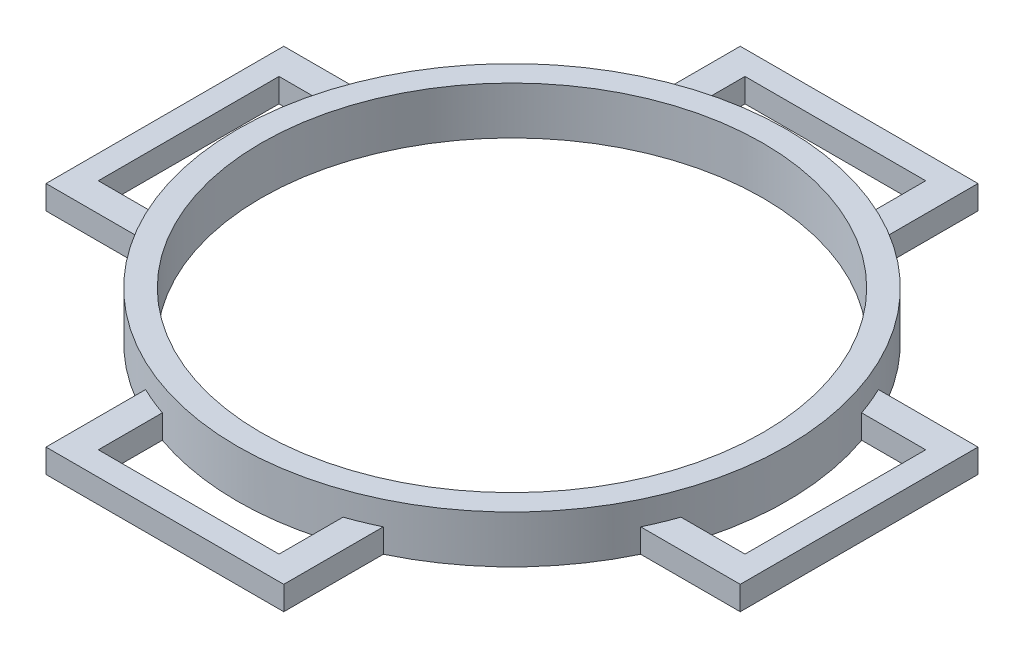
ISO-10303-21;
HEADER;
FILE_DESCRIPTION(('STEP AP214'),'2;1');
FILE_NAME('part.step','',(''),(''),'','','');
FILE_SCHEMA(('AUTOMOTIVE_DESIGN { 1 0 10303 214 1 1 1 1 }'));
ENDSEC;
DATA;
#1=APPLICATION_CONTEXT('core data for automotive mechanical design processes');
#2=APPLICATION_PROTOCOL_DEFINITION('international standard','automotive_design',2000,#1);
#3=PRODUCT_CONTEXT('',#1,'mechanical');
#4=PRODUCT('Part','Part','',(#3));
#5=PRODUCT_RELATED_PRODUCT_CATEGORY('part','',(#4));
#6=PRODUCT_DEFINITION_FORMATION('','',#4);
#7=PRODUCT_DEFINITION_CONTEXT('part definition',#1,'design');
#8=PRODUCT_DEFINITION('design','',#6,#7);
#9=PRODUCT_DEFINITION_SHAPE('','',#8);
#10=(LENGTH_UNIT() NAMED_UNIT(*) SI_UNIT(.MILLI.,.METRE.));
#11=(NAMED_UNIT(*) PLANE_ANGLE_UNIT() SI_UNIT($,.RADIAN.));
#12=(NAMED_UNIT(*) SI_UNIT($,.STERADIAN.) SOLID_ANGLE_UNIT());
#13=UNCERTAINTY_MEASURE_WITH_UNIT(LENGTH_MEASURE(1.E-05),#10,'distance_accuracy_value','');
#14=(GEOMETRIC_REPRESENTATION_CONTEXT(3) GLOBAL_UNCERTAINTY_ASSIGNED_CONTEXT((#13)) GLOBAL_UNIT_ASSIGNED_CONTEXT((#10,
#11,#12)) REPRESENTATION_CONTEXT('',''));
#15=CARTESIAN_POINT('',(0.,0.,0.));
#16=DIRECTION('',(0.,0.,1.));
#17=DIRECTION('',(1.,0.,0.));
#18=AXIS2_PLACEMENT_3D('',#15,#16,#17);
#19=CARTESIAN_POINT('',(0.,18.4724614035785,0.));
#20=DIRECTION('',(0.,1.,0.));
#21=DIRECTION('',(0.,0.,1.));
#22=AXIS2_PLACEMENT_3D('',#19,#20,#21);
#23=CYLINDRICAL_SURFACE('',#22,11.55);
#24=CARTESIAN_POINT('',(0.,1.,0.));
#25=DIRECTION('',(0.,1.,0.));
#26=DIRECTION('',(0.,0.,1.));
#27=AXIS2_PLACEMENT_3D('',#24,#25,#26);
#28=CIRCLE('',#27,11.55);
#29=CARTESIAN_POINT('',(0.,1.,11.55));
#30=VERTEX_POINT('',#29);
#31=EDGE_CURVE('E460',#30,#30,#28,.T.);
#32=ORIENTED_EDGE('',*,*,#31,.F.);
#33=EDGE_LOOP('',(#32));
#34=FACE_BOUND('',#33,.T.);
#35=DIRECTION('',(0.,-1.,0.));
#36=VECTOR('',#35,1.);
#37=CARTESIAN_POINT('',(10.4116521263438,0.,5.00000000000011));
#38=LINE('',#37,#36);
#39=CARTESIAN_POINT('',(10.4116521263438,0.,5.00000000000011));
#40=VERTEX_POINT('',#39);
#41=CARTESIAN_POINT('',(10.4116521263438,-1.,5.00000000000011));
#42=VERTEX_POINT('',#41);
#43=EDGE_CURVE('E55',#40,#42,#38,.T.);
#44=ORIENTED_EDGE('',*,*,#43,.F.);
#45=CARTESIAN_POINT('',(0.,0.,0.));
#46=DIRECTION('',(0.,1.,0.));
#47=DIRECTION('',(0.,0.,1.));
#48=AXIS2_PLACEMENT_3D('',#45,#46,#47);
#49=CIRCLE('',#48,11.55);
#50=CARTESIAN_POINT('',(10.906993169522,0.,3.80000000000011));
#51=VERTEX_POINT('',#50);
#52=EDGE_CURVE('E11',#40,#51,#49,.T.);
#53=ORIENTED_EDGE('',*,*,#52,.T.);
#54=DIRECTION('',(0.,1.,0.));
#55=VECTOR('',#54,1.);
#56=CARTESIAN_POINT('',(10.906993169522,18.4724614035785,3.80000000000011));
#57=LINE('',#56,#55);
#58=CARTESIAN_POINT('',(10.906993169522,-1.,3.80000000000011));
#59=VERTEX_POINT('',#58);
#60=EDGE_CURVE('E299',#59,#51,#57,.T.);
#61=ORIENTED_EDGE('',*,*,#60,.F.);
#62=CARTESIAN_POINT('',(0.,-1.,0.));
#63=DIRECTION('',(0.,1.,0.));
#64=DIRECTION('',(0.,0.,1.));
#65=AXIS2_PLACEMENT_3D('',#62,#63,#64);
#66=CIRCLE('',#65,11.55);
#67=CARTESIAN_POINT('',(10.9069931695221,-1.,-3.79999999999989));
#68=VERTEX_POINT('',#67);
#69=EDGE_CURVE('E508',#59,#68,#66,.T.);
#70=ORIENTED_EDGE('',*,*,#69,.T.);
#71=DIRECTION('',(0.,1.,0.));
#72=VECTOR('',#71,1.);
#73=CARTESIAN_POINT('',(10.9069931695221,18.4724614035785,-3.79999999999989));
#74=LINE('',#73,#72);
#75=CARTESIAN_POINT('',(10.9069931695221,0.,-3.79999999999989));
#76=VERTEX_POINT('',#75);
#77=EDGE_CURVE('E301',#76,#68,#74,.F.);
#78=ORIENTED_EDGE('',*,*,#77,.F.);
#79=CARTESIAN_POINT('',(10.4116521263439,0.,-4.99999999999989));
#80=VERTEX_POINT('',#79);
#81=EDGE_CURVE('E41',#76,#80,#49,.T.);
#82=ORIENTED_EDGE('',*,*,#81,.T.);
#83=DIRECTION('',(0.,-1.,0.));
#84=VECTOR('',#83,1.);
#85=CARTESIAN_POINT('',(10.4116521263439,0.,-4.99999999999989));
#86=LINE('',#85,#84);
#87=CARTESIAN_POINT('',(10.4116521263439,-1.,-4.99999999999989));
#88=VERTEX_POINT('',#87);
#89=EDGE_CURVE('E294',#80,#88,#86,.T.);
#90=ORIENTED_EDGE('',*,*,#89,.T.);
#91=CARTESIAN_POINT('',(5.,-1.,-10.4116521263438));
#92=VERTEX_POINT('',#91);
#93=EDGE_CURVE('E466',#88,#92,#66,.T.);
#94=ORIENTED_EDGE('',*,*,#93,.T.);
#95=DIRECTION('',(0.,-1.,0.));
#96=VECTOR('',#95,1.);
#97=CARTESIAN_POINT('',(5.,0.,-10.4116521263438));
#98=LINE('',#97,#96);
#99=CARTESIAN_POINT('',(5.,0.,-10.4116521263438));
#100=VERTEX_POINT('',#99);
#101=EDGE_CURVE('E348',#100,#92,#98,.T.);
#102=ORIENTED_EDGE('',*,*,#101,.F.);
#103=CARTESIAN_POINT('',(0.,0.,0.));
#104=DIRECTION('',(0.,1.,0.));
#105=DIRECTION('',(0.,0.,1.));
#106=AXIS2_PLACEMENT_3D('',#103,#104,#105);
#107=CIRCLE('',#106,11.55);
#108=CARTESIAN_POINT('',(3.8,0.,-10.906993169522));
#109=VERTEX_POINT('',#108);
#110=EDGE_CURVE('E483',#100,#109,#107,.T.);
#111=ORIENTED_EDGE('',*,*,#110,.T.);
#112=DIRECTION('',(0.,1.,0.));
#113=VECTOR('',#112,1.);
#114=CARTESIAN_POINT('',(3.8,18.4724614035785,-10.906993169522));
#115=LINE('',#114,#113);
#116=CARTESIAN_POINT('',(3.8,-1.,-10.906993169522));
#117=VERTEX_POINT('',#116);
#118=EDGE_CURVE('E351',#117,#109,#115,.T.);
#119=ORIENTED_EDGE('',*,*,#118,.F.);
#120=CARTESIAN_POINT('',(-3.8,-1.,-10.906993169522));
#121=VERTEX_POINT('',#120);
#122=EDGE_CURVE('E507',#117,#121,#66,.T.);
#123=ORIENTED_EDGE('',*,*,#122,.T.);
#124=DIRECTION('',(0.,1.,0.));
#125=VECTOR('',#124,1.);
#126=CARTESIAN_POINT('',(-3.8,18.4724614035785,-10.906993169522));
#127=LINE('',#126,#125);
#128=CARTESIAN_POINT('',(-3.8,0.,-10.906993169522));
#129=VERTEX_POINT('',#128);
#130=EDGE_CURVE('E354',#129,#121,#127,.F.);
#131=ORIENTED_EDGE('',*,*,#130,.F.);
#132=CARTESIAN_POINT('',(-5.,0.,-10.4116521263438));
#133=VERTEX_POINT('',#132);
#134=EDGE_CURVE('E482',#129,#133,#107,.T.);
#135=ORIENTED_EDGE('',*,*,#134,.T.);
#136=DIRECTION('',(0.,-1.,0.));
#137=VECTOR('',#136,1.);
#138=CARTESIAN_POINT('',(-5.,0.,-10.4116521263438));
#139=LINE('',#138,#137);
#140=CARTESIAN_POINT('',(-5.,-1.,-10.4116521263438));
#141=VERTEX_POINT('',#140);
#142=EDGE_CURVE('E339',#133,#141,#139,.T.);
#143=ORIENTED_EDGE('',*,*,#142,.T.);
#144=CARTESIAN_POINT('',(-10.4116521263438,-1.,-5.00000000000004));
#145=VERTEX_POINT('',#144);
#146=EDGE_CURVE('E506',#141,#145,#66,.T.);
#147=ORIENTED_EDGE('',*,*,#146,.T.);
#148=DIRECTION('',(0.,-1.,0.));
#149=VECTOR('',#148,1.);
#150=CARTESIAN_POINT('',(-10.4116521263438,0.,-5.00000000000004));
#151=LINE('',#150,#149);
#152=CARTESIAN_POINT('',(-10.4116521263438,0.,-5.00000000000004));
#153=VERTEX_POINT('',#152);
#154=EDGE_CURVE('E401',#153,#145,#151,.T.);
#155=ORIENTED_EDGE('',*,*,#154,.F.);
#156=CARTESIAN_POINT('',(0.,0.,0.));
#157=DIRECTION('',(0.,1.,0.));
#158=DIRECTION('',(0.,0.,1.));
#159=AXIS2_PLACEMENT_3D('',#156,#157,#158);
#160=CIRCLE('',#159,11.55);
#161=CARTESIAN_POINT('',(-10.906993169522,0.,-3.80000000000004));
#162=VERTEX_POINT('',#161);
#163=EDGE_CURVE('E481',#153,#162,#160,.T.);
#164=ORIENTED_EDGE('',*,*,#163,.T.);
#165=DIRECTION('',(0.,1.,0.));
#166=VECTOR('',#165,1.);
#167=CARTESIAN_POINT('',(-10.906993169522,18.4724614035785,-3.80000000000004));
#168=LINE('',#167,#166);
#169=CARTESIAN_POINT('',(-10.906993169522,-1.,-3.80000000000004));
#170=VERTEX_POINT('',#169);
#171=EDGE_CURVE('E404',#170,#162,#168,.T.);
#172=ORIENTED_EDGE('',*,*,#171,.F.);
#173=CARTESIAN_POINT('',(-10.906993169522,-1.,3.79999999999996));
#174=VERTEX_POINT('',#173);
#175=EDGE_CURVE('E505',#170,#174,#66,.T.);
#176=ORIENTED_EDGE('',*,*,#175,.T.);
#177=DIRECTION('',(0.,1.,0.));
#178=VECTOR('',#177,1.);
#179=CARTESIAN_POINT('',(-10.906993169522,18.4724614035785,3.79999999999996));
#180=LINE('',#179,#178);
#181=CARTESIAN_POINT('',(-10.906993169522,0.,3.79999999999996));
#182=VERTEX_POINT('',#181);
#183=EDGE_CURVE('E407',#182,#174,#180,.F.);
#184=ORIENTED_EDGE('',*,*,#183,.F.);
#185=CARTESIAN_POINT('',(-10.4116521263438,0.,4.99999999999996));
#186=VERTEX_POINT('',#185);
#187=EDGE_CURVE('E480',#182,#186,#160,.T.);
#188=ORIENTED_EDGE('',*,*,#187,.T.);
#189=DIRECTION('',(0.,-1.,0.));
#190=VECTOR('',#189,1.);
#191=CARTESIAN_POINT('',(-10.4116521263438,0.,4.99999999999996));
#192=LINE('',#191,#190);
#193=CARTESIAN_POINT('',(-10.4116521263438,-1.,4.99999999999996));
#194=VERTEX_POINT('',#193);
#195=EDGE_CURVE('E392',#186,#194,#192,.T.);
#196=ORIENTED_EDGE('',*,*,#195,.T.);
#197=CARTESIAN_POINT('',(-5.,-1.,10.4116521263438));
#198=VERTEX_POINT('',#197);
#199=EDGE_CURVE('E465',#194,#198,#66,.T.);
#200=ORIENTED_EDGE('',*,*,#199,.T.);
#201=DIRECTION('',(0.,-1.,0.));
#202=VECTOR('',#201,1.);
#203=CARTESIAN_POINT('',(-5.,0.,10.4116521263438));
#204=LINE('',#203,#202);
#205=CARTESIAN_POINT('',(-5.,0.,10.4116521263438));
#206=VERTEX_POINT('',#205);
#207=EDGE_CURVE('E454',#206,#198,#204,.T.);
#208=ORIENTED_EDGE('',*,*,#207,.F.);
#209=CARTESIAN_POINT('',(0.,0.,0.));
#210=DIRECTION('',(0.,1.,0.));
#211=DIRECTION('',(0.,0.,1.));
#212=AXIS2_PLACEMENT_3D('',#209,#210,#211);
#213=CIRCLE('',#212,11.55);
#214=CARTESIAN_POINT('',(-3.8,0.,10.906993169522));
#215=VERTEX_POINT('',#214);
#216=EDGE_CURVE('E471',#206,#215,#213,.T.);
#217=ORIENTED_EDGE('',*,*,#216,.T.);
#218=DIRECTION('',(0.,1.,0.));
#219=VECTOR('',#218,1.);
#220=CARTESIAN_POINT('',(-3.8,18.4724614035785,10.906993169522));
#221=LINE('',#220,#219);
#222=CARTESIAN_POINT('',(-3.8,-1.,10.906993169522));
#223=VERTEX_POINT('',#222);
#224=EDGE_CURVE('E473',#223,#215,#221,.T.);
#225=ORIENTED_EDGE('',*,*,#224,.F.);
#226=CARTESIAN_POINT('',(3.8,-1.,10.906993169522));
#227=VERTEX_POINT('',#226);
#228=EDGE_CURVE('E463',#223,#227,#66,.T.);
#229=ORIENTED_EDGE('',*,*,#228,.T.);
#230=DIRECTION('',(0.,1.,0.));
#231=VECTOR('',#230,1.);
#232=CARTESIAN_POINT('',(3.8,18.4724614035785,10.906993169522));
#233=LINE('',#232,#231);
#234=CARTESIAN_POINT('',(3.8,0.,10.906993169522));
#235=VERTEX_POINT('',#234);
#236=EDGE_CURVE('E477',#235,#227,#233,.F.);
#237=ORIENTED_EDGE('',*,*,#236,.F.);
#238=CARTESIAN_POINT('',(5.,0.,10.4116521263438));
#239=VERTEX_POINT('',#238);
#240=EDGE_CURVE('E474',#235,#239,#213,.T.);
#241=ORIENTED_EDGE('',*,*,#240,.T.);
#242=DIRECTION('',(0.,-1.,0.));
#243=VECTOR('',#242,1.);
#244=CARTESIAN_POINT('',(5.,0.,10.4116521263438));
#245=LINE('',#244,#243);
#246=CARTESIAN_POINT('',(5.,-1.,10.4116521263438));
#247=VERTEX_POINT('',#246);
#248=EDGE_CURVE('E445',#239,#247,#245,.T.);
#249=ORIENTED_EDGE('',*,*,#248,.T.);
#250=EDGE_CURVE('E467',#247,#42,#66,.T.);
#251=ORIENTED_EDGE('',*,*,#250,.T.);
#252=EDGE_LOOP('',(#44,#53,#61,#70,#78,#82,#90,#94,#102,#111,#119,#123,#131,#135,#143,#147,#155,
#164,#172,#176,#184,#188,#196,#200,#208,#217,#225,#229,#237,#241,#249,#251));
#253=FACE_BOUND('',#252,.T.);
#254=ADVANCED_FACE('F37',(#34,#253),#23,.T.);
#255=CARTESIAN_POINT('',(0.,18.4724614035785,0.));
#256=DIRECTION('',(0.,1.,0.));
#257=DIRECTION('',(0.,0.,1.));
#258=AXIS2_PLACEMENT_3D('',#255,#256,#257);
#259=CYLINDRICAL_SURFACE('',#258,10.55);
#260=CARTESIAN_POINT('',(0.,-1.,0.));
#261=DIRECTION('',(0.,1.,0.));
#262=DIRECTION('',(0.,0.,1.));
#263=AXIS2_PLACEMENT_3D('',#260,#261,#262);
#264=CIRCLE('',#263,10.55);
#265=CARTESIAN_POINT('',(0.,-1.,10.55));
#266=VERTEX_POINT('',#265);
#267=EDGE_CURVE('E468',#266,#266,#264,.T.);
#268=ORIENTED_EDGE('',*,*,#267,.F.);
#269=EDGE_LOOP('',(#268));
#270=FACE_BOUND('',#269,.T.);
#271=CARTESIAN_POINT('',(0.,1.,0.));
#272=DIRECTION('',(0.,1.,0.));
#273=DIRECTION('',(0.,0.,1.));
#274=AXIS2_PLACEMENT_3D('',#271,#272,#273);
#275=CIRCLE('',#274,10.55);
#276=CARTESIAN_POINT('',(0.,1.,10.55));
#277=VERTEX_POINT('',#276);
#278=EDGE_CURVE('E457',#277,#277,#275,.T.);
#279=ORIENTED_EDGE('',*,*,#278,.T.);
#280=EDGE_LOOP('',(#279));
#281=FACE_BOUND('',#280,.T.);
#282=ADVANCED_FACE('F39',(#270,#281),#259,.F.);
#283=CARTESIAN_POINT('',(11.55,-1.,0.));
#284=DIRECTION('',(0.,1.,0.));
#285=DIRECTION('',(0.,0.,1.));
#286=AXIS2_PLACEMENT_3D('',#283,#284,#285);
#287=PLANE('',#286);
#288=ORIENTED_EDGE('',*,*,#69,.F.);
#289=DIRECTION('',(-1.,0.,0.));
#290=VECTOR('',#289,1.);
#291=CARTESIAN_POINT('',(11.55,-1.,3.80000000000012));
#292=LINE('',#291,#290);
#293=CARTESIAN_POINT('',(13.6,-1.,3.80000000000014));
#294=VERTEX_POINT('',#293);
#295=EDGE_CURVE('E251',#294,#59,#292,.T.);
#296=ORIENTED_EDGE('',*,*,#295,.F.);
#297=DIRECTION('',(0.,0.,1.));
#298=VECTOR('',#297,1.);
#299=CARTESIAN_POINT('',(13.6,-1.,0.));
#300=LINE('',#299,#298);
#301=CARTESIAN_POINT('',(13.6,-1.,-3.79999999999986));
#302=VERTEX_POINT('',#301);
#303=EDGE_CURVE('E284',#302,#294,#300,.T.);
#304=ORIENTED_EDGE('',*,*,#303,.F.);
#305=DIRECTION('',(1.,0.,0.));
#306=VECTOR('',#305,1.);
#307=CARTESIAN_POINT('',(11.55,-1.,-3.79999999999988));
#308=LINE('',#307,#306);
#309=EDGE_CURVE('E282',#68,#302,#308,.T.);
#310=ORIENTED_EDGE('',*,*,#309,.F.);
#311=EDGE_LOOP('',(#288,#296,#304,#310));
#312=FACE_BOUND('',#311,.T.);
#313=ORIENTED_EDGE('',*,*,#93,.F.);
#314=DIRECTION('',(-1.,0.,0.));
#315=VECTOR('',#314,1.);
#316=CARTESIAN_POINT('',(11.5500000000001,-1.,-4.99999999999988));
#317=LINE('',#316,#315);
#318=CARTESIAN_POINT('',(14.6000000000001,-1.,-4.99999999999985));
#319=VERTEX_POINT('',#318);
#320=EDGE_CURVE('E279',#319,#88,#317,.T.);
#321=ORIENTED_EDGE('',*,*,#320,.F.);
#322=DIRECTION('',(0.,0.,-1.));
#323=VECTOR('',#322,1.);
#324=CARTESIAN_POINT('',(14.6,-1.,0.));
#325=LINE('',#324,#323);
#326=CARTESIAN_POINT('',(14.5999999999999,-1.,5.00000000000015));
#327=VERTEX_POINT('',#326);
#328=EDGE_CURVE('E277',#327,#319,#325,.T.);
#329=ORIENTED_EDGE('',*,*,#328,.F.);
#330=DIRECTION('',(1.,0.,0.));
#331=VECTOR('',#330,1.);
#332=CARTESIAN_POINT('',(11.5499999999999,-1.,5.00000000000012));
#333=LINE('',#332,#331);
#334=EDGE_CURVE('E257',#42,#327,#333,.T.);
#335=ORIENTED_EDGE('',*,*,#334,.F.);
#336=ORIENTED_EDGE('',*,*,#250,.F.);
#337=DIRECTION('',(0.,0.,-1.));
#338=VECTOR('',#337,1.);
#339=CARTESIAN_POINT('',(5.,-1.,0.));
#340=LINE('',#339,#338);
#341=CARTESIAN_POINT('',(5.,-1.,14.6));
#342=VERTEX_POINT('',#341);
#343=EDGE_CURVE('E430',#342,#247,#340,.T.);
#344=ORIENTED_EDGE('',*,*,#343,.F.);
#345=DIRECTION('',(1.,0.,0.));
#346=VECTOR('',#345,1.);
#347=CARTESIAN_POINT('',(11.55,-1.,14.6));
#348=LINE('',#347,#346);
#349=CARTESIAN_POINT('',(-5.,-1.,14.6));
#350=VERTEX_POINT('',#349);
#351=EDGE_CURVE('E428',#350,#342,#348,.T.);
#352=ORIENTED_EDGE('',*,*,#351,.F.);
#353=DIRECTION('',(0.,0.,1.));
#354=VECTOR('',#353,1.);
#355=CARTESIAN_POINT('',(-5.,-1.,0.));
#356=LINE('',#355,#354);
#357=EDGE_CURVE('E410',#198,#350,#356,.T.);
#358=ORIENTED_EDGE('',*,*,#357,.F.);
#359=ORIENTED_EDGE('',*,*,#199,.F.);
#360=DIRECTION('',(1.,0.,0.));
#361=VECTOR('',#360,1.);
#362=CARTESIAN_POINT('',(11.55,-1.,5.00000000000005));
#363=LINE('',#362,#361);
#364=CARTESIAN_POINT('',(-14.6,-1.,4.99999999999995));
#365=VERTEX_POINT('',#364);
#366=EDGE_CURVE('E377',#365,#194,#363,.T.);
#367=ORIENTED_EDGE('',*,*,#366,.F.);
#368=DIRECTION('',(0.,0.,1.));
#369=VECTOR('',#368,1.);
#370=CARTESIAN_POINT('',(-14.6,-1.,0.));
#371=LINE('',#370,#369);
#372=CARTESIAN_POINT('',(-14.6,-1.,-5.00000000000005));
#373=VERTEX_POINT('',#372);
#374=EDGE_CURVE('E375',#373,#365,#371,.T.);
#375=ORIENTED_EDGE('',*,*,#374,.F.);
#376=DIRECTION('',(-1.,0.,0.));
#377=VECTOR('',#376,1.);
#378=CARTESIAN_POINT('',(11.55,-1.,-4.99999999999997));
#379=LINE('',#378,#377);
#380=EDGE_CURVE('E357',#145,#373,#379,.T.);
#381=ORIENTED_EDGE('',*,*,#380,.F.);
#382=ORIENTED_EDGE('',*,*,#146,.F.);
#383=DIRECTION('',(0.,0.,1.));
#384=VECTOR('',#383,1.);
#385=CARTESIAN_POINT('',(-5.,-1.,0.));
#386=LINE('',#385,#384);
#387=CARTESIAN_POINT('',(-5.,-1.,-14.6));
#388=VERTEX_POINT('',#387);
#389=EDGE_CURVE('E324',#388,#141,#386,.T.);
#390=ORIENTED_EDGE('',*,*,#389,.F.);
#391=DIRECTION('',(-1.,0.,0.));
#392=VECTOR('',#391,1.);
#393=CARTESIAN_POINT('',(11.55,-1.,-14.6));
#394=LINE('',#393,#392);
#395=CARTESIAN_POINT('',(5.,-1.,-14.6));
#396=VERTEX_POINT('',#395);
#397=EDGE_CURVE('E322',#396,#388,#394,.T.);
#398=ORIENTED_EDGE('',*,*,#397,.F.);
#399=DIRECTION('',(0.,0.,-1.));
#400=VECTOR('',#399,1.);
#401=CARTESIAN_POINT('',(5.,-1.,0.));
#402=LINE('',#401,#400);
#403=EDGE_CURVE('E304',#92,#396,#402,.T.);
#404=ORIENTED_EDGE('',*,*,#403,.F.);
#405=EDGE_LOOP('',(#313,#321,#329,#335,#336,#344,#352,#358,#359,#367,#375,#381,#382,#390,#398,#404));
#406=FACE_BOUND('',#405,.T.);
#407=ORIENTED_EDGE('',*,*,#122,.F.);
#408=DIRECTION('',(0.,0.,1.));
#409=VECTOR('',#408,1.);
#410=CARTESIAN_POINT('',(3.8,-1.,0.));
#411=LINE('',#410,#409);
#412=CARTESIAN_POINT('',(3.8,-1.,-13.6));
#413=VERTEX_POINT('',#412);
#414=EDGE_CURVE('E308',#413,#117,#411,.T.);
#415=ORIENTED_EDGE('',*,*,#414,.F.);
#416=DIRECTION('',(1.,0.,0.));
#417=VECTOR('',#416,1.);
#418=CARTESIAN_POINT('',(11.55,-1.,-13.6));
#419=LINE('',#418,#417);
#420=CARTESIAN_POINT('',(-3.8,-1.,-13.6));
#421=VERTEX_POINT('',#420);
#422=EDGE_CURVE('E329',#421,#413,#419,.T.);
#423=ORIENTED_EDGE('',*,*,#422,.F.);
#424=DIRECTION('',(0.,0.,-1.));
#425=VECTOR('',#424,1.);
#426=CARTESIAN_POINT('',(-3.8,-1.,0.));
#427=LINE('',#426,#425);
#428=EDGE_CURVE('E327',#121,#421,#427,.T.);
#429=ORIENTED_EDGE('',*,*,#428,.F.);
#430=EDGE_LOOP('',(#407,#415,#423,#429));
#431=FACE_BOUND('',#430,.T.);
#432=ORIENTED_EDGE('',*,*,#175,.F.);
#433=DIRECTION('',(1.,0.,0.));
#434=VECTOR('',#433,1.);
#435=CARTESIAN_POINT('',(11.55,-1.,-3.79999999999996));
#436=LINE('',#435,#434);
#437=CARTESIAN_POINT('',(-13.6,-1.,-3.80000000000005));
#438=VERTEX_POINT('',#437);
#439=EDGE_CURVE('E361',#438,#170,#436,.T.);
#440=ORIENTED_EDGE('',*,*,#439,.F.);
#441=DIRECTION('',(0.,0.,-1.));
#442=VECTOR('',#441,1.);
#443=CARTESIAN_POINT('',(-13.6,-1.,0.));
#444=LINE('',#443,#442);
#445=CARTESIAN_POINT('',(-13.6,-1.,3.79999999999995));
#446=VERTEX_POINT('',#445);
#447=EDGE_CURVE('E382',#446,#438,#444,.T.);
#448=ORIENTED_EDGE('',*,*,#447,.F.);
#449=DIRECTION('',(-1.,0.,0.));
#450=VECTOR('',#449,1.);
#451=CARTESIAN_POINT('',(11.55,-1.,3.80000000000005));
#452=LINE('',#451,#450);
#453=EDGE_CURVE('E380',#174,#446,#452,.T.);
#454=ORIENTED_EDGE('',*,*,#453,.F.);
#455=EDGE_LOOP('',(#432,#440,#448,#454));
#456=FACE_BOUND('',#455,.T.);
#457=DIRECTION('',(0.,0.,1.));
#458=VECTOR('',#457,1.);
#459=CARTESIAN_POINT('',(3.8,-1.,0.));
#460=LINE('',#459,#458);
#461=CARTESIAN_POINT('',(3.8,-1.,13.6));
#462=VERTEX_POINT('',#461);
#463=EDGE_CURVE('E433',#227,#462,#460,.T.);
#464=ORIENTED_EDGE('',*,*,#463,.F.);
#465=ORIENTED_EDGE('',*,*,#228,.F.);
#466=DIRECTION('',(0.,0.,-1.));
#467=VECTOR('',#466,1.);
#468=CARTESIAN_POINT('',(-3.8,-1.,0.));
#469=LINE('',#468,#467);
#470=CARTESIAN_POINT('',(-3.8,-1.,13.6));
#471=VERTEX_POINT('',#470);
#472=EDGE_CURVE('E414',#471,#223,#469,.T.);
#473=ORIENTED_EDGE('',*,*,#472,.F.);
#474=DIRECTION('',(-1.,0.,0.));
#475=VECTOR('',#474,1.);
#476=CARTESIAN_POINT('',(11.55,-1.,13.6));
#477=LINE('',#476,#475);
#478=EDGE_CURVE('E435',#462,#471,#477,.T.);
#479=ORIENTED_EDGE('',*,*,#478,.F.);
#480=EDGE_LOOP('',(#464,#465,#473,#479));
#481=FACE_BOUND('',#480,.T.);
#482=ORIENTED_EDGE('',*,*,#267,.T.);
#483=EDGE_LOOP('',(#482));
#484=FACE_BOUND('',#483,.T.);
#485=ADVANCED_FACE('F503',(#312,#406,#431,#456,#481,#484),#287,.F.);
#486=CARTESIAN_POINT('',(11.55,1.,0.));
#487=DIRECTION('',(0.,-1.,0.));
#488=DIRECTION('',(0.,0.,-1.));
#489=AXIS2_PLACEMENT_3D('',#486,#487,#488);
#490=PLANE('',#489);
#491=ORIENTED_EDGE('',*,*,#278,.F.);
#492=EDGE_LOOP('',(#491));
#493=FACE_BOUND('',#492,.T.);
#494=ORIENTED_EDGE('',*,*,#31,.T.);
#495=EDGE_LOOP('',(#494));
#496=FACE_BOUND('',#495,.T.);
#497=ADVANCED_FACE('F576',(#493,#496),#490,.F.);
#498=CARTESIAN_POINT('',(3.8,0.,0.));
#499=DIRECTION('',(1.,0.,0.));
#500=DIRECTION('',(0.,0.,-1.));
#501=AXIS2_PLACEMENT_3D('',#498,#499,#500);
#502=PLANE('',#501);
#503=DIRECTION('',(0.,0.,1.));
#504=VECTOR('',#503,1.);
#505=CARTESIAN_POINT('',(3.8,0.,0.));
#506=LINE('',#505,#504);
#507=CARTESIAN_POINT('',(3.8,0.,13.6));
#508=VERTEX_POINT('',#507);
#509=EDGE_CURVE('E419',#235,#508,#506,.T.);
#510=ORIENTED_EDGE('',*,*,#509,.F.);
#511=ORIENTED_EDGE('',*,*,#236,.T.);
#512=ORIENTED_EDGE('',*,*,#463,.T.);
#513=DIRECTION('',(0.,-1.,0.));
#514=VECTOR('',#513,1.);
#515=CARTESIAN_POINT('',(3.8,0.,13.6));
#516=LINE('',#515,#514);
#517=EDGE_CURVE('E442',#508,#462,#516,.T.);
#518=ORIENTED_EDGE('',*,*,#517,.F.);
#519=EDGE_LOOP('',(#510,#511,#512,#518));
#520=FACE_BOUND('',#519,.T.);
#521=ADVANCED_FACE('F583',(#520),#502,.F.);
#522=CARTESIAN_POINT('',(-3.8,0.,0.));
#523=DIRECTION('',(-1.,0.,0.));
#524=DIRECTION('',(0.,0.,1.));
#525=AXIS2_PLACEMENT_3D('',#522,#523,#524);
#526=PLANE('',#525);
#527=ORIENTED_EDGE('',*,*,#472,.T.);
#528=ORIENTED_EDGE('',*,*,#224,.T.);
#529=DIRECTION('',(0.,0.,-1.));
#530=VECTOR('',#529,1.);
#531=CARTESIAN_POINT('',(-3.8,0.,0.));
#532=LINE('',#531,#530);
#533=CARTESIAN_POINT('',(-3.8,0.,13.6));
#534=VERTEX_POINT('',#533);
#535=EDGE_CURVE('E423',#534,#215,#532,.T.);
#536=ORIENTED_EDGE('',*,*,#535,.F.);
#537=DIRECTION('',(0.,-1.,0.));
#538=VECTOR('',#537,1.);
#539=CARTESIAN_POINT('',(-3.8,0.,13.6));
#540=LINE('',#539,#538);
#541=EDGE_CURVE('E426',#534,#471,#540,.T.);
#542=ORIENTED_EDGE('',*,*,#541,.T.);
#543=EDGE_LOOP('',(#527,#528,#536,#542));
#544=FACE_BOUND('',#543,.T.);
#545=ADVANCED_FACE('F631',(#544),#526,.F.);
#546=CARTESIAN_POINT('',(-5.,0.,0.));
#547=DIRECTION('',(1.,0.,0.));
#548=DIRECTION('',(0.,0.,-1.));
#549=AXIS2_PLACEMENT_3D('',#546,#547,#548);
#550=PLANE('',#549);
#551=ORIENTED_EDGE('',*,*,#357,.T.);
#552=DIRECTION('',(0.,-1.,0.));
#553=VECTOR('',#552,1.);
#554=CARTESIAN_POINT('',(-5.,0.,14.6));
#555=LINE('',#554,#553);
#556=CARTESIAN_POINT('',(-5.,0.,14.6));
#557=VERTEX_POINT('',#556);
#558=EDGE_CURVE('E451',#557,#350,#555,.T.);
#559=ORIENTED_EDGE('',*,*,#558,.F.);
#560=DIRECTION('',(0.,0.,1.));
#561=VECTOR('',#560,1.);
#562=CARTESIAN_POINT('',(-5.,0.,0.));
#563=LINE('',#562,#561);
#564=EDGE_CURVE('E411',#206,#557,#563,.T.);
#565=ORIENTED_EDGE('',*,*,#564,.F.);
#566=ORIENTED_EDGE('',*,*,#207,.T.);
#567=EDGE_LOOP('',(#551,#559,#565,#566));
#568=FACE_BOUND('',#567,.T.);
#569=ADVANCED_FACE('F634',(#568),#550,.F.);
#570=CARTESIAN_POINT('',(11.55,0.,14.6));
#571=DIRECTION('',(0.,0.,-1.));
#572=DIRECTION('',(-1.,0.,0.));
#573=AXIS2_PLACEMENT_3D('',#570,#571,#572);
#574=PLANE('',#573);
#575=ORIENTED_EDGE('',*,*,#351,.T.);
#576=DIRECTION('',(0.,-1.,0.));
#577=VECTOR('',#576,1.);
#578=CARTESIAN_POINT('',(5.,0.,14.6));
#579=LINE('',#578,#577);
#580=CARTESIAN_POINT('',(5.,0.,14.6));
#581=VERTEX_POINT('',#580);
#582=EDGE_CURVE('E448',#581,#342,#579,.T.);
#583=ORIENTED_EDGE('',*,*,#582,.F.);
#584=DIRECTION('',(1.,0.,0.));
#585=VECTOR('',#584,1.);
#586=CARTESIAN_POINT('',(11.55,0.,14.6));
#587=LINE('',#586,#585);
#588=EDGE_CURVE('E413',#557,#581,#587,.T.);
#589=ORIENTED_EDGE('',*,*,#588,.F.);
#590=ORIENTED_EDGE('',*,*,#558,.T.);
#591=EDGE_LOOP('',(#575,#583,#589,#590));
#592=FACE_BOUND('',#591,.T.);
#593=ADVANCED_FACE('F645',(#592),#574,.F.);
#594=CARTESIAN_POINT('',(5.,0.,0.));
#595=DIRECTION('',(-1.,0.,0.));
#596=DIRECTION('',(0.,0.,1.));
#597=AXIS2_PLACEMENT_3D('',#594,#595,#596);
#598=PLANE('',#597);
#599=ORIENTED_EDGE('',*,*,#343,.T.);
#600=ORIENTED_EDGE('',*,*,#248,.F.);
#601=DIRECTION('',(0.,0.,-1.));
#602=VECTOR('',#601,1.);
#603=CARTESIAN_POINT('',(5.,0.,0.));
#604=LINE('',#603,#602);
#605=EDGE_CURVE('E416',#581,#239,#604,.T.);
#606=ORIENTED_EDGE('',*,*,#605,.F.);
#607=ORIENTED_EDGE('',*,*,#582,.T.);
#608=EDGE_LOOP('',(#599,#600,#606,#607));
#609=FACE_BOUND('',#608,.T.);
#610=ADVANCED_FACE('F638',(#609),#598,.F.);
#611=CARTESIAN_POINT('',(11.55,0.,13.6));
#612=DIRECTION('',(0.,0.,1.));
#613=DIRECTION('',(1.,0.,0.));
#614=AXIS2_PLACEMENT_3D('',#611,#612,#613);
#615=PLANE('',#614);
#616=ORIENTED_EDGE('',*,*,#478,.T.);
#617=ORIENTED_EDGE('',*,*,#541,.F.);
#618=DIRECTION('',(-1.,0.,0.));
#619=VECTOR('',#618,1.);
#620=CARTESIAN_POINT('',(11.55,0.,13.6));
#621=LINE('',#620,#619);
#622=EDGE_CURVE('E421',#508,#534,#621,.T.);
#623=ORIENTED_EDGE('',*,*,#622,.F.);
#624=ORIENTED_EDGE('',*,*,#517,.T.);
#625=EDGE_LOOP('',(#616,#617,#623,#624));
#626=FACE_BOUND('',#625,.T.);
#627=ADVANCED_FACE('F562',(#626),#615,.F.);
#628=CARTESIAN_POINT('',(0.,0.,0.));
#629=DIRECTION('',(0.,1.,0.));
#630=DIRECTION('',(0.,0.,1.));
#631=AXIS2_PLACEMENT_3D('',#628,#629,#630);
#632=PLANE('',#631);
#633=ORIENTED_EDGE('',*,*,#240,.F.);
#634=ORIENTED_EDGE('',*,*,#509,.T.);
#635=ORIENTED_EDGE('',*,*,#622,.T.);
#636=ORIENTED_EDGE('',*,*,#535,.T.);
#637=ORIENTED_EDGE('',*,*,#216,.F.);
#638=ORIENTED_EDGE('',*,*,#564,.T.);
#639=ORIENTED_EDGE('',*,*,#588,.T.);
#640=ORIENTED_EDGE('',*,*,#605,.T.);
#641=EDGE_LOOP('',(#633,#634,#635,#636,#637,#638,#639,#640));
#642=FACE_BOUND('',#641,.T.);
#643=ADVANCED_FACE('F555',(#642),#632,.T.);
#644=CARTESIAN_POINT('',(11.55,0.,3.80000000000005));
#645=DIRECTION('',(0.,0.,1.));
#646=DIRECTION('',(1.,0.,0.));
#647=AXIS2_PLACEMENT_3D('',#644,#645,#646);
#648=PLANE('',#647);
#649=DIRECTION('',(-1.,0.,0.));
#650=VECTOR('',#649,1.);
#651=CARTESIAN_POINT('',(11.55,0.,3.80000000000004));
#652=LINE('',#651,#650);
#653=CARTESIAN_POINT('',(-13.6,0.,3.79999999999995));
#654=VERTEX_POINT('',#653);
#655=EDGE_CURVE('E366',#182,#654,#652,.T.);
#656=ORIENTED_EDGE('',*,*,#655,.F.);
#657=ORIENTED_EDGE('',*,*,#183,.T.);
#658=ORIENTED_EDGE('',*,*,#453,.T.);
#659=DIRECTION('',(0.,-1.,0.));
#660=VECTOR('',#659,1.);
#661=CARTESIAN_POINT('',(-13.6,0.,3.79999999999995));
#662=LINE('',#661,#660);
#663=EDGE_CURVE('E389',#654,#446,#662,.T.);
#664=ORIENTED_EDGE('',*,*,#663,.F.);
#665=EDGE_LOOP('',(#656,#657,#658,#664));
#666=FACE_BOUND('',#665,.T.);
#667=ADVANCED_FACE('F553',(#666),#648,.F.);
#668=CARTESIAN_POINT('',(11.55,0.,-3.79999999999996));
#669=DIRECTION('',(0.,0.,-1.));
#670=DIRECTION('',(-1.,0.,0.));
#671=AXIS2_PLACEMENT_3D('',#668,#669,#670);
#672=PLANE('',#671);
#673=ORIENTED_EDGE('',*,*,#439,.T.);
#674=ORIENTED_EDGE('',*,*,#171,.T.);
#675=DIRECTION('',(1.,0.,0.));
#676=VECTOR('',#675,1.);
#677=CARTESIAN_POINT('',(11.55,0.,-3.79999999999996));
#678=LINE('',#677,#676);
#679=CARTESIAN_POINT('',(-13.6,0.,-3.80000000000005));
#680=VERTEX_POINT('',#679);
#681=EDGE_CURVE('E370',#680,#162,#678,.T.);
#682=ORIENTED_EDGE('',*,*,#681,.F.);
#683=DIRECTION('',(0.,-1.,0.));
#684=VECTOR('',#683,1.);
#685=CARTESIAN_POINT('',(-13.6,0.,-3.80000000000005));
#686=LINE('',#685,#684);
#687=EDGE_CURVE('E373',#680,#438,#686,.T.);
#688=ORIENTED_EDGE('',*,*,#687,.T.);
#689=EDGE_LOOP('',(#673,#674,#682,#688));
#690=FACE_BOUND('',#689,.T.);
#691=ADVANCED_FACE('F491',(#690),#672,.F.);
#692=CARTESIAN_POINT('',(11.55,0.,-4.99999999999997));
#693=DIRECTION('',(0.,0.,1.));
#694=DIRECTION('',(1.,0.,0.));
#695=AXIS2_PLACEMENT_3D('',#692,#693,#694);
#696=PLANE('',#695);
#697=ORIENTED_EDGE('',*,*,#380,.T.);
#698=DIRECTION('',(0.,-1.,0.));
#699=VECTOR('',#698,1.);
#700=CARTESIAN_POINT('',(-14.6,0.,-5.00000000000005));
#701=LINE('',#700,#699);
#702=CARTESIAN_POINT('',(-14.6,0.,-5.00000000000005));
#703=VERTEX_POINT('',#702);
#704=EDGE_CURVE('E398',#703,#373,#701,.T.);
#705=ORIENTED_EDGE('',*,*,#704,.F.);
#706=DIRECTION('',(-1.,0.,0.));
#707=VECTOR('',#706,1.);
#708=CARTESIAN_POINT('',(11.55,0.,-4.99999999999997));
#709=LINE('',#708,#707);
#710=EDGE_CURVE('E358',#153,#703,#709,.T.);
#711=ORIENTED_EDGE('',*,*,#710,.F.);
#712=ORIENTED_EDGE('',*,*,#154,.T.);
#713=EDGE_LOOP('',(#697,#705,#711,#712));
#714=FACE_BOUND('',#713,.T.);
#715=ADVANCED_FACE('F542',(#714),#696,.F.);
#716=CARTESIAN_POINT('',(-14.6,0.,0.));
#717=DIRECTION('',(1.,0.,0.));
#718=DIRECTION('',(0.,0.,-1.));
#719=AXIS2_PLACEMENT_3D('',#716,#717,#718);
#720=PLANE('',#719);
#721=ORIENTED_EDGE('',*,*,#374,.T.);
#722=DIRECTION('',(0.,-1.,0.));
#723=VECTOR('',#722,1.);
#724=CARTESIAN_POINT('',(-14.6,0.,4.99999999999995));
#725=LINE('',#724,#723);
#726=CARTESIAN_POINT('',(-14.6,0.,4.99999999999995));
#727=VERTEX_POINT('',#726);
#728=EDGE_CURVE('E395',#727,#365,#725,.T.);
#729=ORIENTED_EDGE('',*,*,#728,.F.);
#730=DIRECTION('',(0.,0.,1.));
#731=VECTOR('',#730,1.);
#732=CARTESIAN_POINT('',(-14.6,0.,0.));
#733=LINE('',#732,#731);
#734=EDGE_CURVE('E360',#703,#727,#733,.T.);
#735=ORIENTED_EDGE('',*,*,#734,.F.);
#736=ORIENTED_EDGE('',*,*,#704,.T.);
#737=EDGE_LOOP('',(#721,#729,#735,#736));
#738=FACE_BOUND('',#737,.T.);
#739=ADVANCED_FACE('F548',(#738),#720,.F.);
#740=CARTESIAN_POINT('',(11.55,0.,5.00000000000005));
#741=DIRECTION('',(0.,0.,-1.));
#742=DIRECTION('',(-1.,0.,0.));
#743=AXIS2_PLACEMENT_3D('',#740,#741,#742);
#744=PLANE('',#743);
#745=ORIENTED_EDGE('',*,*,#366,.T.);
#746=ORIENTED_EDGE('',*,*,#195,.F.);
#747=DIRECTION('',(1.,0.,0.));
#748=VECTOR('',#747,1.);
#749=CARTESIAN_POINT('',(11.55,0.,5.00000000000005));
#750=LINE('',#749,#748);
#751=EDGE_CURVE('E363',#727,#186,#750,.T.);
#752=ORIENTED_EDGE('',*,*,#751,.F.);
#753=ORIENTED_EDGE('',*,*,#728,.T.);
#754=EDGE_LOOP('',(#745,#746,#752,#753));
#755=FACE_BOUND('',#754,.T.);
#756=ADVANCED_FACE('F550',(#755),#744,.F.);
#757=CARTESIAN_POINT('',(-13.6,0.,0.));
#758=DIRECTION('',(-1.,0.,0.));
#759=DIRECTION('',(0.,0.,1.));
#760=AXIS2_PLACEMENT_3D('',#757,#758,#759);
#761=PLANE('',#760);
#762=ORIENTED_EDGE('',*,*,#447,.T.);
#763=ORIENTED_EDGE('',*,*,#687,.F.);
#764=DIRECTION('',(0.,0.,-1.));
#765=VECTOR('',#764,1.);
#766=CARTESIAN_POINT('',(-13.6,0.,0.));
#767=LINE('',#766,#765);
#768=EDGE_CURVE('E368',#654,#680,#767,.T.);
#769=ORIENTED_EDGE('',*,*,#768,.F.);
#770=ORIENTED_EDGE('',*,*,#663,.T.);
#771=EDGE_LOOP('',(#762,#763,#769,#770));
#772=FACE_BOUND('',#771,.T.);
#773=ADVANCED_FACE('F499',(#772),#761,.F.);
#774=CARTESIAN_POINT('',(0.,0.,0.));
#775=DIRECTION('',(0.,1.,0.));
#776=DIRECTION('',(0.,0.,1.));
#777=AXIS2_PLACEMENT_3D('',#774,#775,#776);
#778=PLANE('',#777);
#779=ORIENTED_EDGE('',*,*,#163,.F.);
#780=ORIENTED_EDGE('',*,*,#710,.T.);
#781=ORIENTED_EDGE('',*,*,#734,.T.);
#782=ORIENTED_EDGE('',*,*,#751,.T.);
#783=ORIENTED_EDGE('',*,*,#187,.F.);
#784=ORIENTED_EDGE('',*,*,#655,.T.);
#785=ORIENTED_EDGE('',*,*,#768,.T.);
#786=ORIENTED_EDGE('',*,*,#681,.T.);
#787=EDGE_LOOP('',(#779,#780,#781,#782,#783,#784,#785,#786));
#788=FACE_BOUND('',#787,.T.);
#789=ADVANCED_FACE('F492',(#788),#778,.T.);
#790=CARTESIAN_POINT('',(-3.8,0.,0.));
#791=DIRECTION('',(-1.,0.,0.));
#792=DIRECTION('',(0.,0.,1.));
#793=AXIS2_PLACEMENT_3D('',#790,#791,#792);
#794=PLANE('',#793);
#795=DIRECTION('',(0.,0.,-1.));
#796=VECTOR('',#795,1.);
#797=CARTESIAN_POINT('',(-3.8,0.,0.));
#798=LINE('',#797,#796);
#799=CARTESIAN_POINT('',(-3.8,0.,-13.6));
#800=VERTEX_POINT('',#799);
#801=EDGE_CURVE('E313',#129,#800,#798,.T.);
#802=ORIENTED_EDGE('',*,*,#801,.F.);
#803=ORIENTED_EDGE('',*,*,#130,.T.);
#804=ORIENTED_EDGE('',*,*,#428,.T.);
#805=DIRECTION('',(0.,-1.,0.));
#806=VECTOR('',#805,1.);
#807=CARTESIAN_POINT('',(-3.8,0.,-13.6));
#808=LINE('',#807,#806);
#809=EDGE_CURVE('E336',#800,#421,#808,.T.);
#810=ORIENTED_EDGE('',*,*,#809,.F.);
#811=EDGE_LOOP('',(#802,#803,#804,#810));
#812=FACE_BOUND('',#811,.T.);
#813=ADVANCED_FACE('F515',(#812),#794,.F.);
#814=CARTESIAN_POINT('',(3.8,0.,0.));
#815=DIRECTION('',(1.,0.,0.));
#816=DIRECTION('',(0.,0.,-1.));
#817=AXIS2_PLACEMENT_3D('',#814,#815,#816);
#818=PLANE('',#817);
#819=ORIENTED_EDGE('',*,*,#414,.T.);
#820=ORIENTED_EDGE('',*,*,#118,.T.);
#821=DIRECTION('',(0.,0.,1.));
#822=VECTOR('',#821,1.);
#823=CARTESIAN_POINT('',(3.8,0.,0.));
#824=LINE('',#823,#822);
#825=CARTESIAN_POINT('',(3.8,0.,-13.6));
#826=VERTEX_POINT('',#825);
#827=EDGE_CURVE('E317',#826,#109,#824,.T.);
#828=ORIENTED_EDGE('',*,*,#827,.F.);
#829=DIRECTION('',(0.,-1.,0.));
#830=VECTOR('',#829,1.);
#831=CARTESIAN_POINT('',(3.8,0.,-13.6));
#832=LINE('',#831,#830);
#833=EDGE_CURVE('E320',#826,#413,#832,.T.);
#834=ORIENTED_EDGE('',*,*,#833,.T.);
#835=EDGE_LOOP('',(#819,#820,#828,#834));
#836=FACE_BOUND('',#835,.T.);
#837=ADVANCED_FACE('F524',(#836),#818,.F.);
#838=CARTESIAN_POINT('',(5.,0.,0.));
#839=DIRECTION('',(-1.,0.,0.));
#840=DIRECTION('',(0.,0.,1.));
#841=AXIS2_PLACEMENT_3D('',#838,#839,#840);
#842=PLANE('',#841);
#843=ORIENTED_EDGE('',*,*,#403,.T.);
#844=DIRECTION('',(0.,-1.,0.));
#845=VECTOR('',#844,1.);
#846=CARTESIAN_POINT('',(5.,0.,-14.6));
#847=LINE('',#846,#845);
#848=CARTESIAN_POINT('',(5.,0.,-14.6));
#849=VERTEX_POINT('',#848);
#850=EDGE_CURVE('E345',#849,#396,#847,.T.);
#851=ORIENTED_EDGE('',*,*,#850,.F.);
#852=DIRECTION('',(0.,0.,-1.));
#853=VECTOR('',#852,1.);
#854=CARTESIAN_POINT('',(5.,0.,0.));
#855=LINE('',#854,#853);
#856=EDGE_CURVE('E305',#100,#849,#855,.T.);
#857=ORIENTED_EDGE('',*,*,#856,.F.);
#858=ORIENTED_EDGE('',*,*,#101,.T.);
#859=EDGE_LOOP('',(#843,#851,#857,#858));
#860=FACE_BOUND('',#859,.T.);
#861=ADVANCED_FACE('F606',(#860),#842,.F.);
#862=CARTESIAN_POINT('',(11.55,0.,-14.6));
#863=DIRECTION('',(0.,0.,1.));
#864=DIRECTION('',(1.,0.,0.));
#865=AXIS2_PLACEMENT_3D('',#862,#863,#864);
#866=PLANE('',#865);
#867=ORIENTED_EDGE('',*,*,#397,.T.);
#868=DIRECTION('',(0.,-1.,0.));
#869=VECTOR('',#868,1.);
#870=CARTESIAN_POINT('',(-5.,0.,-14.6));
#871=LINE('',#870,#869);
#872=CARTESIAN_POINT('',(-5.,0.,-14.6));
#873=VERTEX_POINT('',#872);
#874=EDGE_CURVE('E342',#873,#388,#871,.T.);
#875=ORIENTED_EDGE('',*,*,#874,.F.);
#876=DIRECTION('',(-1.,0.,0.));
#877=VECTOR('',#876,1.);
#878=CARTESIAN_POINT('',(11.55,0.,-14.6));
#879=LINE('',#878,#877);
#880=EDGE_CURVE('E307',#849,#873,#879,.T.);
#881=ORIENTED_EDGE('',*,*,#880,.F.);
#882=ORIENTED_EDGE('',*,*,#850,.T.);
#883=EDGE_LOOP('',(#867,#875,#881,#882));
#884=FACE_BOUND('',#883,.T.);
#885=ADVANCED_FACE('F608',(#884),#866,.F.);
#886=CARTESIAN_POINT('',(-5.,0.,0.));
#887=DIRECTION('',(1.,0.,0.));
#888=DIRECTION('',(0.,0.,-1.));
#889=AXIS2_PLACEMENT_3D('',#886,#887,#888);
#890=PLANE('',#889);
#891=ORIENTED_EDGE('',*,*,#389,.T.);
#892=ORIENTED_EDGE('',*,*,#142,.F.);
#893=DIRECTION('',(0.,0.,1.));
#894=VECTOR('',#893,1.);
#895=CARTESIAN_POINT('',(-5.,0.,0.));
#896=LINE('',#895,#894);
#897=EDGE_CURVE('E310',#873,#133,#896,.T.);
#898=ORIENTED_EDGE('',*,*,#897,.F.);
#899=ORIENTED_EDGE('',*,*,#874,.T.);
#900=EDGE_LOOP('',(#891,#892,#898,#899));
#901=FACE_BOUND('',#900,.T.);
#902=ADVANCED_FACE('F534',(#901),#890,.F.);
#903=CARTESIAN_POINT('',(11.55,0.,-13.6));
#904=DIRECTION('',(0.,0.,-1.));
#905=DIRECTION('',(-1.,0.,0.));
#906=AXIS2_PLACEMENT_3D('',#903,#904,#905);
#907=PLANE('',#906);
#908=ORIENTED_EDGE('',*,*,#422,.T.);
#909=ORIENTED_EDGE('',*,*,#833,.F.);
#910=DIRECTION('',(1.,0.,0.));
#911=VECTOR('',#910,1.);
#912=CARTESIAN_POINT('',(11.55,0.,-13.6));
#913=LINE('',#912,#911);
#914=EDGE_CURVE('E315',#800,#826,#913,.T.);
#915=ORIENTED_EDGE('',*,*,#914,.F.);
#916=ORIENTED_EDGE('',*,*,#809,.T.);
#917=EDGE_LOOP('',(#908,#909,#915,#916));
#918=FACE_BOUND('',#917,.T.);
#919=ADVANCED_FACE('F520',(#918),#907,.F.);
#920=CARTESIAN_POINT('',(0.,0.,0.));
#921=DIRECTION('',(0.,1.,0.));
#922=DIRECTION('',(0.,0.,1.));
#923=AXIS2_PLACEMENT_3D('',#920,#921,#922);
#924=PLANE('',#923);
#925=ORIENTED_EDGE('',*,*,#110,.F.);
#926=ORIENTED_EDGE('',*,*,#856,.T.);
#927=ORIENTED_EDGE('',*,*,#880,.T.);
#928=ORIENTED_EDGE('',*,*,#897,.T.);
#929=ORIENTED_EDGE('',*,*,#134,.F.);
#930=ORIENTED_EDGE('',*,*,#801,.T.);
#931=ORIENTED_EDGE('',*,*,#914,.T.);
#932=ORIENTED_EDGE('',*,*,#827,.T.);
#933=EDGE_LOOP('',(#925,#926,#927,#928,#929,#930,#931,#932));
#934=FACE_BOUND('',#933,.T.);
#935=ADVANCED_FACE('F527',(#934),#924,.T.);
#936=CARTESIAN_POINT('',(11.55,0.,-3.79999999999988));
#937=DIRECTION('',(0.,0.,-1.));
#938=DIRECTION('',(-1.,0.,0.));
#939=AXIS2_PLACEMENT_3D('',#936,#937,#938);
#940=PLANE('',#939);
#941=DIRECTION('',(1.,0.,0.));
#942=VECTOR('',#941,1.);
#943=CARTESIAN_POINT('',(11.55,0.,-3.79999999999988));
#944=LINE('',#943,#942);
#945=CARTESIAN_POINT('',(13.6,0.,-3.79999999999986));
#946=VERTEX_POINT('',#945);
#947=EDGE_CURVE('E267',#76,#946,#944,.T.);
#948=ORIENTED_EDGE('',*,*,#947,.F.);
#949=ORIENTED_EDGE('',*,*,#77,.T.);
#950=ORIENTED_EDGE('',*,*,#309,.T.);
#951=DIRECTION('',(0.,-1.,0.));
#952=VECTOR('',#951,1.);
#953=CARTESIAN_POINT('',(13.6,0.,-3.79999999999986));
#954=LINE('',#953,#952);
#955=EDGE_CURVE('E291',#946,#302,#954,.T.);
#956=ORIENTED_EDGE('',*,*,#955,.F.);
#957=EDGE_LOOP('',(#948,#949,#950,#956));
#958=FACE_BOUND('',#957,.T.);
#959=ADVANCED_FACE('F597',(#958),#940,.F.);
#960=CARTESIAN_POINT('',(11.55,0.,3.80000000000012));
#961=DIRECTION('',(0.,0.,1.));
#962=DIRECTION('',(1.,0.,0.));
#963=AXIS2_PLACEMENT_3D('',#960,#961,#962);
#964=PLANE('',#963);
#965=ORIENTED_EDGE('',*,*,#295,.T.);
#966=ORIENTED_EDGE('',*,*,#60,.T.);
#967=DIRECTION('',(-1.,0.,0.));
#968=VECTOR('',#967,1.);
#969=CARTESIAN_POINT('',(11.55,0.,3.80000000000012));
#970=LINE('',#969,#968);
#971=CARTESIAN_POINT('',(13.6,0.,3.80000000000014));
#972=VERTEX_POINT('',#971);
#973=EDGE_CURVE('E273',#972,#51,#970,.T.);
#974=ORIENTED_EDGE('',*,*,#973,.F.);
#975=DIRECTION('',(0.,-1.,0.));
#976=VECTOR('',#975,1.);
#977=CARTESIAN_POINT('',(13.6,0.,3.80000000000014));
#978=LINE('',#977,#976);
#979=EDGE_CURVE('E275',#972,#294,#978,.T.);
#980=ORIENTED_EDGE('',*,*,#979,.T.);
#981=EDGE_LOOP('',(#965,#966,#974,#980));
#982=FACE_BOUND('',#981,.T.);
#983=ADVANCED_FACE('F589',(#982),#964,.F.);
#984=CARTESIAN_POINT('',(11.5499999999999,0.,5.00000000000012));
#985=DIRECTION('',(0.,0.,-1.));
#986=DIRECTION('',(-1.,0.,0.));
#987=AXIS2_PLACEMENT_3D('',#984,#985,#986);
#988=PLANE('',#987);
#989=ORIENTED_EDGE('',*,*,#334,.T.);
#990=DIRECTION('',(0.,-1.,0.));
#991=VECTOR('',#990,1.);
#992=CARTESIAN_POINT('',(14.5999999999999,0.,5.00000000000015));
#993=LINE('',#992,#991);
#994=CARTESIAN_POINT('',(14.5999999999999,0.,5.00000000000015));
#995=VERTEX_POINT('',#994);
#996=EDGE_CURVE('E254',#995,#327,#993,.T.);
#997=ORIENTED_EDGE('',*,*,#996,.F.);
#998=DIRECTION('',(1.,0.,0.));
#999=VECTOR('',#998,1.);
#1000=CARTESIAN_POINT('',(11.5499999999999,0.,5.00000000000012));
#1001=LINE('',#1000,#999);
#1002=EDGE_CURVE('E242',#40,#995,#1001,.T.);
#1003=ORIENTED_EDGE('',*,*,#1002,.F.);
#1004=ORIENTED_EDGE('',*,*,#43,.T.);
#1005=EDGE_LOOP('',(#989,#997,#1003,#1004));
#1006=FACE_BOUND('',#1005,.T.);
#1007=ADVANCED_FACE('F255',(#1006),#988,.F.);
#1008=CARTESIAN_POINT('',(14.6,0.,0.));
#1009=DIRECTION('',(-1.,0.,0.));
#1010=DIRECTION('',(0.,0.,1.));
#1011=AXIS2_PLACEMENT_3D('',#1008,#1009,#1010);
#1012=PLANE('',#1011);
#1013=ORIENTED_EDGE('',*,*,#328,.T.);
#1014=DIRECTION('',(0.,-1.,0.));
#1015=VECTOR('',#1014,1.);
#1016=CARTESIAN_POINT('',(14.6000000000001,0.,-4.99999999999985));
#1017=LINE('',#1016,#1015);
#1018=CARTESIAN_POINT('',(14.6000000000001,0.,-4.99999999999985));
#1019=VERTEX_POINT('',#1018);
#1020=EDGE_CURVE('E260',#1019,#319,#1017,.T.);
#1021=ORIENTED_EDGE('',*,*,#1020,.F.);
#1022=DIRECTION('',(0.,0.,-1.));
#1023=VECTOR('',#1022,1.);
#1024=CARTESIAN_POINT('',(14.6,0.,0.));
#1025=LINE('',#1024,#1023);
#1026=EDGE_CURVE('E247',#995,#1019,#1025,.T.);
#1027=ORIENTED_EDGE('',*,*,#1026,.F.);
#1028=ORIENTED_EDGE('',*,*,#996,.T.);
#1029=EDGE_LOOP('',(#1013,#1021,#1027,#1028));
#1030=FACE_BOUND('',#1029,.T.);
#1031=ADVANCED_FACE('F262',(#1030),#1012,.F.);
#1032=CARTESIAN_POINT('',(11.5500000000001,0.,-4.99999999999988));
#1033=DIRECTION('',(0.,0.,1.));
#1034=DIRECTION('',(1.,0.,0.));
#1035=AXIS2_PLACEMENT_3D('',#1032,#1033,#1034);
#1036=PLANE('',#1035);
#1037=ORIENTED_EDGE('',*,*,#320,.T.);
#1038=ORIENTED_EDGE('',*,*,#89,.F.);
#1039=DIRECTION('',(-1.,0.,0.));
#1040=VECTOR('',#1039,1.);
#1041=CARTESIAN_POINT('',(11.5500000000001,0.,-4.99999999999988));
#1042=LINE('',#1041,#1040);
#1043=EDGE_CURVE('E265',#1019,#80,#1042,.T.);
#1044=ORIENTED_EDGE('',*,*,#1043,.F.);
#1045=ORIENTED_EDGE('',*,*,#1020,.T.);
#1046=EDGE_LOOP('',(#1037,#1038,#1044,#1045));
#1047=FACE_BOUND('',#1046,.T.);
#1048=ADVANCED_FACE('F601',(#1047),#1036,.F.);
#1049=CARTESIAN_POINT('',(13.6,0.,0.));
#1050=DIRECTION('',(1.,0.,0.));
#1051=DIRECTION('',(0.,0.,-1.));
#1052=AXIS2_PLACEMENT_3D('',#1049,#1050,#1051);
#1053=PLANE('',#1052);
#1054=ORIENTED_EDGE('',*,*,#303,.T.);
#1055=ORIENTED_EDGE('',*,*,#979,.F.);
#1056=DIRECTION('',(0.,0.,1.));
#1057=VECTOR('',#1056,1.);
#1058=CARTESIAN_POINT('',(13.6,0.,0.));
#1059=LINE('',#1058,#1057);
#1060=EDGE_CURVE('E271',#946,#972,#1059,.T.);
#1061=ORIENTED_EDGE('',*,*,#1060,.F.);
#1062=ORIENTED_EDGE('',*,*,#955,.T.);
#1063=EDGE_LOOP('',(#1054,#1055,#1061,#1062));
#1064=FACE_BOUND('',#1063,.T.);
#1065=ADVANCED_FACE('F593',(#1064),#1053,.F.);
#1066=CARTESIAN_POINT('',(0.,0.,0.));
#1067=DIRECTION('',(0.,1.,0.));
#1068=DIRECTION('',(0.,0.,1.));
#1069=AXIS2_PLACEMENT_3D('',#1066,#1067,#1068);
#1070=PLANE('',#1069);
#1071=ORIENTED_EDGE('',*,*,#52,.F.);
#1072=ORIENTED_EDGE('',*,*,#1002,.T.);
#1073=ORIENTED_EDGE('',*,*,#1026,.T.);
#1074=ORIENTED_EDGE('',*,*,#1043,.T.);
#1075=ORIENTED_EDGE('',*,*,#81,.F.);
#1076=ORIENTED_EDGE('',*,*,#947,.T.);
#1077=ORIENTED_EDGE('',*,*,#1060,.T.);
#1078=ORIENTED_EDGE('',*,*,#973,.T.);
#1079=EDGE_LOOP('',(#1071,#1072,#1073,#1074,#1075,#1076,#1077,#1078));
#1080=FACE_BOUND('',#1079,.T.);
#1081=ADVANCED_FACE('F244',(#1080),#1070,.T.);
#1082=CLOSED_SHELL('',(#254,#282,#485,#497,#521,#545,#569,#593,#610,#627,#643,#667,#691,#715,
#739,#756,#773,#789,#813,#837,#861,#885,#902,#919,#935,#959,#983,#1007,#1031,#1048,#1065,#1081));
#1083=MANIFOLD_SOLID_BREP('B2',#1082);
#1084=ADVANCED_BREP_SHAPE_REPRESENTATION('',(#18,#1083),#14);
#1085=SHAPE_DEFINITION_REPRESENTATION(#9,#1084);
ENDSEC;
END-ISO-10303-21;
